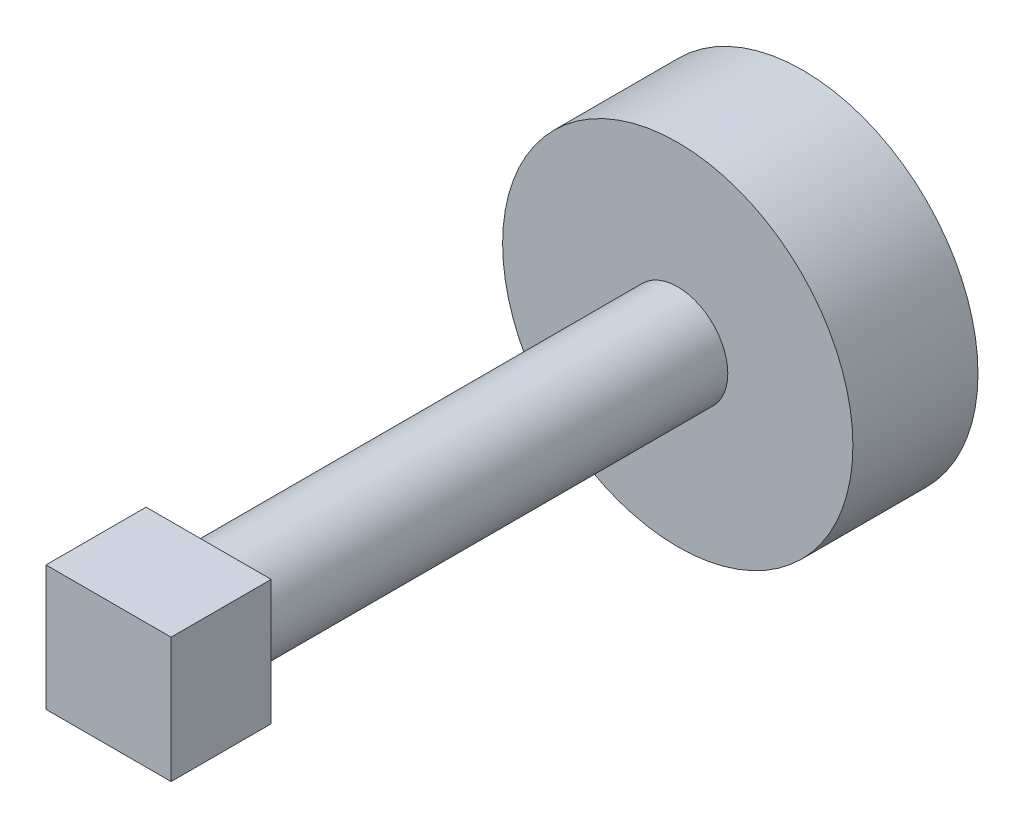
ISO-10303-21;
HEADER;
FILE_DESCRIPTION(('STEP AP214'),'2;1');
FILE_NAME('part.step','',(''),(''),'','','');
FILE_SCHEMA(('AUTOMOTIVE_DESIGN { 1 0 10303 214 1 1 1 1 }'));
ENDSEC;
DATA;
#1=APPLICATION_CONTEXT('core data for automotive mechanical design processes');
#2=APPLICATION_PROTOCOL_DEFINITION('international standard','automotive_design',2000,#1);
#3=PRODUCT_CONTEXT('',#1,'mechanical');
#4=PRODUCT('Part','Part','',(#3));
#5=PRODUCT_RELATED_PRODUCT_CATEGORY('part','',(#4));
#6=PRODUCT_DEFINITION_FORMATION('','',#4);
#7=PRODUCT_DEFINITION_CONTEXT('part definition',#1,'design');
#8=PRODUCT_DEFINITION('design','',#6,#7);
#9=PRODUCT_DEFINITION_SHAPE('','',#8);
#10=(LENGTH_UNIT() NAMED_UNIT(*) SI_UNIT(.MILLI.,.METRE.));
#11=(NAMED_UNIT(*) PLANE_ANGLE_UNIT() SI_UNIT($,.RADIAN.));
#12=(NAMED_UNIT(*) SI_UNIT($,.STERADIAN.) SOLID_ANGLE_UNIT());
#13=UNCERTAINTY_MEASURE_WITH_UNIT(LENGTH_MEASURE(1.E-05),#10,'distance_accuracy_value','');
#14=(GEOMETRIC_REPRESENTATION_CONTEXT(3) GLOBAL_UNCERTAINTY_ASSIGNED_CONTEXT((#13)) GLOBAL_UNIT_ASSIGNED_CONTEXT((#10,
#11,#12)) REPRESENTATION_CONTEXT('',''));
#15=CARTESIAN_POINT('',(0.,0.,0.));
#16=DIRECTION('',(0.,0.,1.));
#17=DIRECTION('',(1.,0.,0.));
#18=AXIS2_PLACEMENT_3D('',#15,#16,#17);
#19=CARTESIAN_POINT('',(0.,0.,10.));
#20=DIRECTION('',(0.,0.,-1.));
#21=DIRECTION('',(-1.,0.,0.));
#22=AXIS2_PLACEMENT_3D('',#19,#20,#21);
#23=CYLINDRICAL_SURFACE('',#22,14.);
#24=CARTESIAN_POINT('',(0.,0.,10.));
#25=DIRECTION('',(0.,0.,1.));
#26=DIRECTION('',(1.,0.,0.));
#27=AXIS2_PLACEMENT_3D('',#24,#25,#26);
#28=CIRCLE('',#27,14.);
#29=CARTESIAN_POINT('',(14.,0.,10.));
#30=VERTEX_POINT('',#29);
#31=EDGE_CURVE('E42',#30,#30,#28,.T.);
#32=ORIENTED_EDGE('',*,*,#31,.F.);
#33=EDGE_LOOP('',(#32));
#34=FACE_BOUND('',#33,.T.);
#35=CARTESIAN_POINT('',(0.,0.,0.));
#36=DIRECTION('',(0.,0.,1.));
#37=DIRECTION('',(1.,0.,0.));
#38=AXIS2_PLACEMENT_3D('',#35,#36,#37);
#39=CIRCLE('',#38,14.);
#40=CARTESIAN_POINT('',(14.,0.,0.));
#41=VERTEX_POINT('',#40);
#42=EDGE_CURVE('E123',#41,#41,#39,.T.);
#43=ORIENTED_EDGE('',*,*,#42,.T.);
#44=EDGE_LOOP('',(#43));
#45=FACE_BOUND('',#44,.T.);
#46=ADVANCED_FACE('F33',(#34,#45),#23,.T.);
#47=CARTESIAN_POINT('',(0.,0.,10.));
#48=DIRECTION('',(0.,0.,1.));
#49=DIRECTION('',(1.,0.,0.));
#50=AXIS2_PLACEMENT_3D('',#47,#48,#49);
#51=PLANE('',#50);
#52=CARTESIAN_POINT('',(0.,0.,10.));
#53=DIRECTION('',(0.,0.,1.));
#54=DIRECTION('',(1.,0.,0.));
#55=AXIS2_PLACEMENT_3D('',#52,#53,#54);
#56=CIRCLE('',#55,4.);
#57=CARTESIAN_POINT('',(4.,0.,10.));
#58=VERTEX_POINT('',#57);
#59=EDGE_CURVE('E11',#58,#58,#56,.T.);
#60=ORIENTED_EDGE('',*,*,#59,.F.);
#61=EDGE_LOOP('',(#60));
#62=FACE_BOUND('',#61,.T.);
#63=ORIENTED_EDGE('',*,*,#31,.T.);
#64=EDGE_LOOP('',(#63));
#65=FACE_BOUND('',#64,.T.);
#66=ADVANCED_FACE('F132',(#62,#65),#51,.T.);
#67=CARTESIAN_POINT('',(0.,0.,0.));
#68=DIRECTION('',(0.,0.,1.));
#69=DIRECTION('',(1.,0.,0.));
#70=AXIS2_PLACEMENT_3D('',#67,#68,#69);
#71=PLANE('',#70);
#72=CARTESIAN_POINT('',(0.,0.,0.));
#73=DIRECTION('',(0.,0.,-1.));
#74=DIRECTION('',(-1.,0.,0.));
#75=AXIS2_PLACEMENT_3D('',#72,#73,#74);
#76=CIRCLE('',#75,5.);
#77=CARTESIAN_POINT('',(-5.,0.,0.));
#78=VERTEX_POINT('',#77);
#79=EDGE_CURVE('E113',#78,#78,#76,.T.);
#80=ORIENTED_EDGE('',*,*,#79,.F.);
#81=EDGE_LOOP('',(#80));
#82=FACE_BOUND('',#81,.T.);
#83=ORIENTED_EDGE('',*,*,#42,.F.);
#84=EDGE_LOOP('',(#83));
#85=FACE_BOUND('',#84,.T.);
#86=ADVANCED_FACE('F129',(#82,#85),#71,.F.);
#87=CARTESIAN_POINT('',(0.,0.,1.8));
#88=DIRECTION('',(0.,0.,-1.));
#89=DIRECTION('',(-1.,0.,0.));
#90=AXIS2_PLACEMENT_3D('',#87,#88,#89);
#91=PLANE('',#90);
#92=CARTESIAN_POINT('',(0.,0.,1.8));
#93=DIRECTION('',(0.,0.,-1.));
#94=DIRECTION('',(-1.,0.,0.));
#95=AXIS2_PLACEMENT_3D('',#92,#93,#94);
#96=CIRCLE('',#95,5.);
#97=CARTESIAN_POINT('',(-5.,0.,1.8));
#98=VERTEX_POINT('',#97);
#99=EDGE_CURVE('E115',#98,#98,#96,.T.);
#100=ORIENTED_EDGE('',*,*,#99,.T.);
#101=EDGE_LOOP('',(#100));
#102=FACE_BOUND('',#101,.T.);
#103=CARTESIAN_POINT('',(0.,0.,1.8));
#104=DIRECTION('',(0.,0.,-1.));
#105=DIRECTION('',(-1.,0.,0.));
#106=AXIS2_PLACEMENT_3D('',#103,#104,#105);
#107=CIRCLE('',#106,2.25);
#108=CARTESIAN_POINT('',(-2.25,0.,1.8));
#109=VERTEX_POINT('',#108);
#110=EDGE_CURVE('E36',#109,#109,#107,.F.);
#111=ORIENTED_EDGE('',*,*,#110,.T.);
#112=EDGE_LOOP('',(#111));
#113=FACE_BOUND('',#112,.T.);
#114=ADVANCED_FACE('F131',(#102,#113),#91,.T.);
#115=CARTESIAN_POINT('',(0.,0.,1.8));
#116=DIRECTION('',(0.,0.,-1.));
#117=DIRECTION('',(-1.,0.,0.));
#118=AXIS2_PLACEMENT_3D('',#115,#116,#117);
#119=CYLINDRICAL_SURFACE('',#118,5.);
#120=ORIENTED_EDGE('',*,*,#99,.F.);
#121=EDGE_LOOP('',(#120));
#122=FACE_BOUND('',#121,.T.);
#123=ORIENTED_EDGE('',*,*,#79,.T.);
#124=EDGE_LOOP('',(#123));
#125=FACE_BOUND('',#124,.T.);
#126=ADVANCED_FACE('F138',(#122,#125),#119,.F.);
#127=CARTESIAN_POINT('',(0.,0.,5.));
#128=DIRECTION('',(0.,0.,-1.));
#129=DIRECTION('',(-1.,0.,0.));
#130=AXIS2_PLACEMENT_3D('',#127,#128,#129);
#131=PLANE('',#130);
#132=CARTESIAN_POINT('',(0.,0.,5.));
#133=DIRECTION('',(0.,0.,-1.));
#134=DIRECTION('',(-1.,0.,0.));
#135=AXIS2_PLACEMENT_3D('',#132,#133,#134);
#136=CIRCLE('',#135,2.25);
#137=CARTESIAN_POINT('',(-2.25,0.,5.));
#138=VERTEX_POINT('',#137);
#139=EDGE_CURVE('E120',#138,#138,#136,.T.);
#140=ORIENTED_EDGE('',*,*,#139,.T.);
#141=EDGE_LOOP('',(#140));
#142=FACE_BOUND('',#141,.T.);
#143=ADVANCED_FACE('F234',(#142),#131,.T.);
#144=CARTESIAN_POINT('',(0.,0.,5.));
#145=DIRECTION('',(0.,0.,-1.));
#146=DIRECTION('',(-1.,0.,0.));
#147=AXIS2_PLACEMENT_3D('',#144,#145,#146);
#148=CYLINDRICAL_SURFACE('',#147,2.25);
#149=ORIENTED_EDGE('',*,*,#139,.F.);
#150=EDGE_LOOP('',(#149));
#151=FACE_BOUND('',#150,.T.);
#152=ORIENTED_EDGE('',*,*,#110,.F.);
#153=EDGE_LOOP('',(#152));
#154=FACE_BOUND('',#153,.T.);
#155=ADVANCED_FACE('F162',(#151,#154),#148,.F.);
#156=CARTESIAN_POINT('',(0.,0.,47.5));
#157=DIRECTION('',(0.,0.,-1.));
#158=DIRECTION('',(-1.,0.,0.));
#159=AXIS2_PLACEMENT_3D('',#156,#157,#158);
#160=CYLINDRICAL_SURFACE('',#159,4.);
#161=CARTESIAN_POINT('',(0.,0.,47.5));
#162=DIRECTION('',(0.,0.,1.));
#163=DIRECTION('',(1.,0.,0.));
#164=AXIS2_PLACEMENT_3D('',#161,#162,#163);
#165=CIRCLE('',#164,4.);
#166=CARTESIAN_POINT('',(4.,0.,47.5));
#167=VERTEX_POINT('',#166);
#168=EDGE_CURVE('E111',#167,#167,#165,.T.);
#169=ORIENTED_EDGE('',*,*,#168,.F.);
#170=EDGE_LOOP('',(#169));
#171=FACE_BOUND('',#170,.T.);
#172=ORIENTED_EDGE('',*,*,#59,.T.);
#173=EDGE_LOOP('',(#172));
#174=FACE_BOUND('',#173,.T.);
#175=ADVANCED_FACE('F167',(#171,#174),#160,.T.);
#176=CARTESIAN_POINT('',(5.,-5.,55.5));
#177=DIRECTION('',(-1.,0.,0.));
#178=DIRECTION('',(0.,0.,1.));
#179=AXIS2_PLACEMENT_3D('',#176,#177,#178);
#180=PLANE('',#179);
#181=DIRECTION('',(0.,1.,0.));
#182=VECTOR('',#181,1.);
#183=CARTESIAN_POINT('',(5.,-5.,47.5));
#184=LINE('',#183,#182);
#185=CARTESIAN_POINT('',(5.,-5.,47.5));
#186=VERTEX_POINT('',#185);
#187=CARTESIAN_POINT('',(5.,5.,47.5));
#188=VERTEX_POINT('',#187);
#189=EDGE_CURVE('E102',#186,#188,#184,.T.);
#190=ORIENTED_EDGE('',*,*,#189,.T.);
#191=DIRECTION('',(0.,0.,-1.));
#192=VECTOR('',#191,1.);
#193=CARTESIAN_POINT('',(5.,5.,55.5));
#194=LINE('',#193,#192);
#195=CARTESIAN_POINT('',(5.,5.,55.5));
#196=VERTEX_POINT('',#195);
#197=EDGE_CURVE('E93',#196,#188,#194,.T.);
#198=ORIENTED_EDGE('',*,*,#197,.F.);
#199=DIRECTION('',(0.,1.,0.));
#200=VECTOR('',#199,1.);
#201=CARTESIAN_POINT('',(5.,-5.,55.5));
#202=LINE('',#201,#200);
#203=CARTESIAN_POINT('',(5.,-5.,55.5));
#204=VERTEX_POINT('',#203);
#205=EDGE_CURVE('E87',#204,#196,#202,.T.);
#206=ORIENTED_EDGE('',*,*,#205,.F.);
#207=DIRECTION('',(0.,0.,-1.));
#208=VECTOR('',#207,1.);
#209=CARTESIAN_POINT('',(5.,-5.,55.5));
#210=LINE('',#209,#208);
#211=EDGE_CURVE('E98',#204,#186,#210,.T.);
#212=ORIENTED_EDGE('',*,*,#211,.T.);
#213=EDGE_LOOP('',(#190,#198,#206,#212));
#214=FACE_BOUND('',#213,.T.);
#215=ADVANCED_FACE('F172',(#214),#180,.F.);
#216=CARTESIAN_POINT('',(-5.,5.,55.5));
#217=DIRECTION('',(0.,-1.,0.));
#218=DIRECTION('',(0.,0.,-1.));
#219=AXIS2_PLACEMENT_3D('',#216,#217,#218);
#220=PLANE('',#219);
#221=DIRECTION('',(-1.,0.,0.));
#222=VECTOR('',#221,1.);
#223=CARTESIAN_POINT('',(-5.,5.,47.5));
#224=LINE('',#223,#222);
#225=CARTESIAN_POINT('',(-5.,5.,47.5));
#226=VERTEX_POINT('',#225);
#227=EDGE_CURVE('E92',#188,#226,#224,.T.);
#228=ORIENTED_EDGE('',*,*,#227,.T.);
#229=DIRECTION('',(0.,0.,-1.));
#230=VECTOR('',#229,1.);
#231=CARTESIAN_POINT('',(-5.,5.,55.5));
#232=LINE('',#231,#230);
#233=CARTESIAN_POINT('',(-5.,5.,55.5));
#234=VERTEX_POINT('',#233);
#235=EDGE_CURVE('E90',#234,#226,#232,.T.);
#236=ORIENTED_EDGE('',*,*,#235,.F.);
#237=DIRECTION('',(-1.,0.,0.));
#238=VECTOR('',#237,1.);
#239=CARTESIAN_POINT('',(-5.,5.,55.5));
#240=LINE('',#239,#238);
#241=EDGE_CURVE('E82',#196,#234,#240,.T.);
#242=ORIENTED_EDGE('',*,*,#241,.F.);
#243=ORIENTED_EDGE('',*,*,#197,.T.);
#244=EDGE_LOOP('',(#228,#236,#242,#243));
#245=FACE_BOUND('',#244,.T.);
#246=ADVANCED_FACE('F91',(#245),#220,.F.);
#247=CARTESIAN_POINT('',(-5.,-5.,55.5));
#248=DIRECTION('',(1.,0.,0.));
#249=DIRECTION('',(0.,0.,-1.));
#250=AXIS2_PLACEMENT_3D('',#247,#248,#249);
#251=PLANE('',#250);
#252=DIRECTION('',(0.,-1.,0.));
#253=VECTOR('',#252,1.);
#254=CARTESIAN_POINT('',(-5.,-5.,47.5));
#255=LINE('',#254,#253);
#256=CARTESIAN_POINT('',(-5.,-5.,47.5));
#257=VERTEX_POINT('',#256);
#258=EDGE_CURVE('E68',#226,#257,#255,.T.);
#259=ORIENTED_EDGE('',*,*,#258,.T.);
#260=DIRECTION('',(0.,0.,-1.));
#261=VECTOR('',#260,1.);
#262=CARTESIAN_POINT('',(-5.,-5.,55.5));
#263=LINE('',#262,#261);
#264=CARTESIAN_POINT('',(-5.,-5.,55.5));
#265=VERTEX_POINT('',#264);
#266=EDGE_CURVE('E94',#265,#257,#263,.T.);
#267=ORIENTED_EDGE('',*,*,#266,.F.);
#268=DIRECTION('',(0.,-1.,0.));
#269=VECTOR('',#268,1.);
#270=CARTESIAN_POINT('',(-5.,-5.,55.5));
#271=LINE('',#270,#269);
#272=EDGE_CURVE('E85',#234,#265,#271,.T.);
#273=ORIENTED_EDGE('',*,*,#272,.F.);
#274=ORIENTED_EDGE('',*,*,#235,.T.);
#275=EDGE_LOOP('',(#259,#267,#273,#274));
#276=FACE_BOUND('',#275,.T.);
#277=ADVANCED_FACE('F96',(#276),#251,.F.);
#278=CARTESIAN_POINT('',(-5.,-5.,55.5));
#279=DIRECTION('',(0.,1.,0.));
#280=DIRECTION('',(0.,0.,1.));
#281=AXIS2_PLACEMENT_3D('',#278,#279,#280);
#282=PLANE('',#281);
#283=DIRECTION('',(1.,0.,0.));
#284=VECTOR('',#283,1.);
#285=CARTESIAN_POINT('',(-5.,-5.,47.5));
#286=LINE('',#285,#284);
#287=EDGE_CURVE('E74',#257,#186,#286,.T.);
#288=ORIENTED_EDGE('',*,*,#287,.T.);
#289=ORIENTED_EDGE('',*,*,#211,.F.);
#290=DIRECTION('',(1.,0.,0.));
#291=VECTOR('',#290,1.);
#292=CARTESIAN_POINT('',(-5.,-5.,55.5));
#293=LINE('',#292,#291);
#294=EDGE_CURVE('E51',#265,#204,#293,.T.);
#295=ORIENTED_EDGE('',*,*,#294,.F.);
#296=ORIENTED_EDGE('',*,*,#266,.T.);
#297=EDGE_LOOP('',(#288,#289,#295,#296));
#298=FACE_BOUND('',#297,.T.);
#299=ADVANCED_FACE('F200',(#298),#282,.F.);
#300=CARTESIAN_POINT('',(0.,0.,55.5));
#301=DIRECTION('',(0.,0.,-1.));
#302=DIRECTION('',(-1.,0.,0.));
#303=AXIS2_PLACEMENT_3D('',#300,#301,#302);
#304=PLANE('',#303);
#305=ORIENTED_EDGE('',*,*,#205,.T.);
#306=ORIENTED_EDGE('',*,*,#241,.T.);
#307=ORIENTED_EDGE('',*,*,#272,.T.);
#308=ORIENTED_EDGE('',*,*,#294,.T.);
#309=EDGE_LOOP('',(#305,#306,#307,#308));
#310=FACE_BOUND('',#309,.T.);
#311=ADVANCED_FACE('F83',(#310),#304,.F.);
#312=CARTESIAN_POINT('',(0.,0.,47.5));
#313=DIRECTION('',(0.,0.,-1.));
#314=DIRECTION('',(-1.,0.,0.));
#315=AXIS2_PLACEMENT_3D('',#312,#313,#314);
#316=PLANE('',#315);
#317=ORIENTED_EDGE('',*,*,#168,.T.);
#318=EDGE_LOOP('',(#317));
#319=FACE_BOUND('',#318,.T.);
#320=ORIENTED_EDGE('',*,*,#189,.F.);
#321=ORIENTED_EDGE('',*,*,#287,.F.);
#322=ORIENTED_EDGE('',*,*,#258,.F.);
#323=ORIENTED_EDGE('',*,*,#227,.F.);
#324=EDGE_LOOP('',(#320,#321,#322,#323));
#325=FACE_BOUND('',#324,.T.);
#326=ADVANCED_FACE('F217',(#319,#325),#316,.T.);
#327=CLOSED_SHELL('',(#46,#66,#86,#114,#126,#143,#155,#175,#215,#246,#277,#299,#311,#326));
#328=MANIFOLD_SOLID_BREP('B2',#327);
#329=ADVANCED_BREP_SHAPE_REPRESENTATION('',(#18,#328),#14);
#330=SHAPE_DEFINITION_REPRESENTATION(#9,#329);
ENDSEC;
END-ISO-10303-21;
